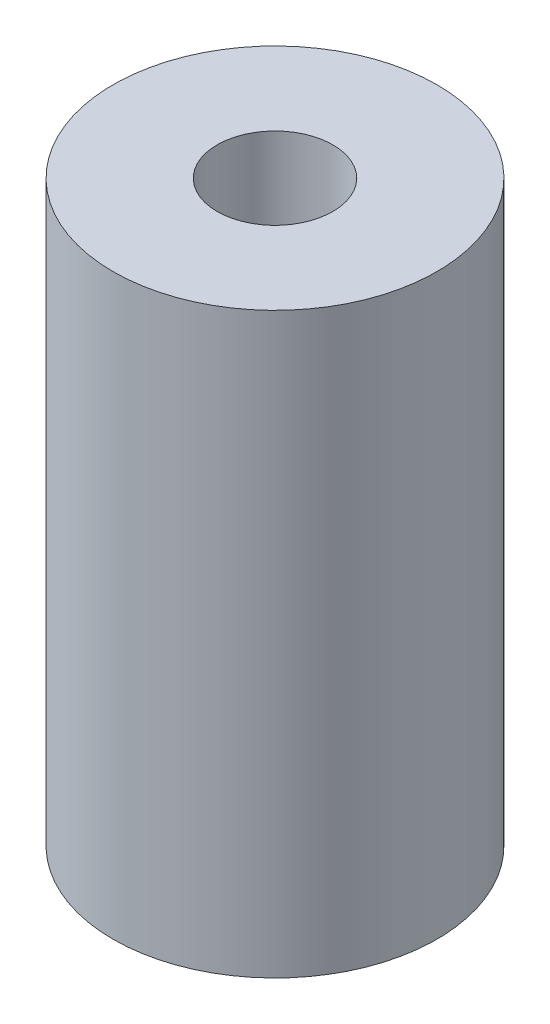
ISO-10303-21;
HEADER;
FILE_DESCRIPTION(('STEP AP214'),'2;1');
FILE_NAME('part.step','',(''),(''),'','','');
FILE_SCHEMA(('AUTOMOTIVE_DESIGN { 1 0 10303 214 1 1 1 1 }'));
ENDSEC;
DATA;
#1=APPLICATION_CONTEXT('core data for automotive mechanical design processes');
#2=APPLICATION_PROTOCOL_DEFINITION('international standard','automotive_design',2000,#1);
#3=PRODUCT_CONTEXT('',#1,'mechanical');
#4=PRODUCT('Part','Part','',(#3));
#5=PRODUCT_RELATED_PRODUCT_CATEGORY('part','',(#4));
#6=PRODUCT_DEFINITION_FORMATION('','',#4);
#7=PRODUCT_DEFINITION_CONTEXT('part definition',#1,'design');
#8=PRODUCT_DEFINITION('design','',#6,#7);
#9=PRODUCT_DEFINITION_SHAPE('','',#8);
#10=(LENGTH_UNIT() NAMED_UNIT(*) SI_UNIT(.MILLI.,.METRE.));
#11=(NAMED_UNIT(*) PLANE_ANGLE_UNIT() SI_UNIT($,.RADIAN.));
#12=(NAMED_UNIT(*) SI_UNIT($,.STERADIAN.) SOLID_ANGLE_UNIT());
#13=UNCERTAINTY_MEASURE_WITH_UNIT(LENGTH_MEASURE(1.E-05),#10,'distance_accuracy_value','');
#14=(GEOMETRIC_REPRESENTATION_CONTEXT(3) GLOBAL_UNCERTAINTY_ASSIGNED_CONTEXT((#13)) GLOBAL_UNIT_ASSIGNED_CONTEXT((#10,
#11,#12)) REPRESENTATION_CONTEXT('',''));
#15=CARTESIAN_POINT('',(0.,0.,0.));
#16=DIRECTION('',(0.,0.,1.));
#17=DIRECTION('',(1.,0.,0.));
#18=AXIS2_PLACEMENT_3D('',#15,#16,#17);
#19=CARTESIAN_POINT('',(0.,25.,0.));
#20=DIRECTION('',(0.,-1.,0.));
#21=DIRECTION('',(0.,0.,-1.));
#22=AXIS2_PLACEMENT_3D('',#19,#20,#21);
#23=CYLINDRICAL_SURFACE('',#22,7.);
#24=CARTESIAN_POINT('',(0.,25.,0.));
#25=DIRECTION('',(0.,1.,0.));
#26=DIRECTION('',(0.,0.,1.));
#27=AXIS2_PLACEMENT_3D('',#24,#25,#26);
#28=CIRCLE('',#27,7.);
#29=CARTESIAN_POINT('',(0.,25.,7.));
#30=VERTEX_POINT('',#29);
#31=EDGE_CURVE('E10',#30,#30,#28,.T.);
#32=ORIENTED_EDGE('',*,*,#31,.F.);
#33=EDGE_LOOP('',(#32));
#34=FACE_BOUND('',#33,.T.);
#35=CARTESIAN_POINT('',(0.,0.,0.));
#36=DIRECTION('',(0.,1.,0.));
#37=DIRECTION('',(0.,0.,1.));
#38=AXIS2_PLACEMENT_3D('',#35,#36,#37);
#39=CIRCLE('',#38,7.);
#40=CARTESIAN_POINT('',(0.,0.,7.));
#41=VERTEX_POINT('',#40);
#42=EDGE_CURVE('E36',#41,#41,#39,.T.);
#43=ORIENTED_EDGE('',*,*,#42,.T.);
#44=EDGE_LOOP('',(#43));
#45=FACE_BOUND('',#44,.T.);
#46=ADVANCED_FACE('F33',(#34,#45),#23,.T.);
#47=CARTESIAN_POINT('',(0.,25.,0.));
#48=DIRECTION('',(0.,1.,0.));
#49=DIRECTION('',(0.,0.,1.));
#50=AXIS2_PLACEMENT_3D('',#47,#48,#49);
#51=PLANE('',#50);
#52=CARTESIAN_POINT('',(0.,25.,0.));
#53=DIRECTION('',(0.,1.,0.));
#54=DIRECTION('',(0.,0.,1.));
#55=AXIS2_PLACEMENT_3D('',#52,#53,#54);
#56=CIRCLE('',#55,2.5);
#57=CARTESIAN_POINT('',(0.,25.,2.5));
#58=VERTEX_POINT('',#57);
#59=EDGE_CURVE('E43',#58,#58,#56,.T.);
#60=ORIENTED_EDGE('',*,*,#59,.F.);
#61=EDGE_LOOP('',(#60));
#62=FACE_BOUND('',#61,.T.);
#63=ORIENTED_EDGE('',*,*,#31,.T.);
#64=EDGE_LOOP('',(#63));
#65=FACE_BOUND('',#64,.T.);
#66=ADVANCED_FACE('F70',(#62,#65),#51,.T.);
#67=CARTESIAN_POINT('',(0.,0.,0.));
#68=DIRECTION('',(0.,1.,0.));
#69=DIRECTION('',(0.,0.,1.));
#70=AXIS2_PLACEMENT_3D('',#67,#68,#69);
#71=PLANE('',#70);
#72=CARTESIAN_POINT('',(0.,0.,0.));
#73=DIRECTION('',(0.,-1.,0.));
#74=DIRECTION('',(0.,0.,-1.));
#75=AXIS2_PLACEMENT_3D('',#72,#73,#74);
#76=CIRCLE('',#75,4.);
#77=CARTESIAN_POINT('',(0.,0.,-4.));
#78=VERTEX_POINT('',#77);
#79=EDGE_CURVE('E51',#78,#78,#76,.T.);
#80=ORIENTED_EDGE('',*,*,#79,.F.);
#81=EDGE_LOOP('',(#80));
#82=FACE_BOUND('',#81,.T.);
#83=ORIENTED_EDGE('',*,*,#42,.F.);
#84=EDGE_LOOP('',(#83));
#85=FACE_BOUND('',#84,.T.);
#86=ADVANCED_FACE('F66',(#82,#85),#71,.F.);
#87=CARTESIAN_POINT('',(0.,13.,0.));
#88=DIRECTION('',(0.,1.,0.));
#89=DIRECTION('',(0.,0.,1.));
#90=AXIS2_PLACEMENT_3D('',#87,#88,#89);
#91=CYLINDRICAL_SURFACE('',#90,2.5);
#92=CARTESIAN_POINT('',(0.,13.,0.));
#93=DIRECTION('',(0.,1.,0.));
#94=DIRECTION('',(0.,0.,1.));
#95=AXIS2_PLACEMENT_3D('',#92,#93,#94);
#96=CIRCLE('',#95,2.5);
#97=CARTESIAN_POINT('',(0.,13.,2.5));
#98=VERTEX_POINT('',#97);
#99=EDGE_CURVE('E47',#98,#98,#96,.T.);
#100=ORIENTED_EDGE('',*,*,#99,.F.);
#101=EDGE_LOOP('',(#100));
#102=FACE_BOUND('',#101,.T.);
#103=ORIENTED_EDGE('',*,*,#59,.T.);
#104=EDGE_LOOP('',(#103));
#105=FACE_BOUND('',#104,.T.);
#106=ADVANCED_FACE('F69',(#102,#105),#91,.F.);
#107=CARTESIAN_POINT('',(0.,13.,0.));
#108=DIRECTION('',(0.,-1.,0.));
#109=DIRECTION('',(0.,0.,-1.));
#110=AXIS2_PLACEMENT_3D('',#107,#108,#109);
#111=PLANE('',#110);
#112=CARTESIAN_POINT('',(0.,13.,0.));
#113=DIRECTION('',(0.,-1.,0.));
#114=DIRECTION('',(0.,0.,-1.));
#115=AXIS2_PLACEMENT_3D('',#112,#113,#114);
#116=CIRCLE('',#115,4.);
#117=CARTESIAN_POINT('',(0.,13.,-4.));
#118=VERTEX_POINT('',#117);
#119=EDGE_CURVE('E50',#118,#118,#116,.T.);
#120=ORIENTED_EDGE('',*,*,#119,.T.);
#121=EDGE_LOOP('',(#120));
#122=FACE_BOUND('',#121,.T.);
#123=ORIENTED_EDGE('',*,*,#99,.T.);
#124=EDGE_LOOP('',(#123));
#125=FACE_BOUND('',#124,.T.);
#126=ADVANCED_FACE('F57',(#122,#125),#111,.T.);
#127=CARTESIAN_POINT('',(0.,13.,0.));
#128=DIRECTION('',(0.,-1.,0.));
#129=DIRECTION('',(0.,0.,-1.));
#130=AXIS2_PLACEMENT_3D('',#127,#128,#129);
#131=CYLINDRICAL_SURFACE('',#130,4.);
#132=CARTESIAN_POINT('',(0.,13.,-4.));
#133=CARTESIAN_POINT('',(0.,12.8645833333333,-4.));
#134=CARTESIAN_POINT('',(0.,12.7291666666667,-4.));
#135=CARTESIAN_POINT('',(0.,12.4583333333333,-4.));
#136=CARTESIAN_POINT('',(0.,12.3229166666667,-4.));
#137=CARTESIAN_POINT('',(0.,12.0520833333333,-4.));
#138=CARTESIAN_POINT('',(0.,11.9166666666667,-4.));
#139=CARTESIAN_POINT('',(0.,11.6458333333333,-4.));
#140=CARTESIAN_POINT('',(0.,11.5104166666667,-4.));
#141=CARTESIAN_POINT('',(0.,11.2395833333333,-4.));
#142=CARTESIAN_POINT('',(0.,11.1041666666667,-4.));
#143=CARTESIAN_POINT('',(0.,10.8333333333333,-4.));
#144=CARTESIAN_POINT('',(0.,10.6979166666667,-4.));
#145=CARTESIAN_POINT('',(0.,10.4270833333333,-4.));
#146=CARTESIAN_POINT('',(0.,10.2916666666667,-4.));
#147=CARTESIAN_POINT('',(0.,10.0208333333333,-4.));
#148=CARTESIAN_POINT('',(0.,9.88541666666667,-4.));
#149=CARTESIAN_POINT('',(0.,9.61458333333333,-4.));
#150=CARTESIAN_POINT('',(0.,9.47916666666667,-4.));
#151=CARTESIAN_POINT('',(0.,9.20833333333333,-4.));
#152=CARTESIAN_POINT('',(0.,9.07291666666667,-4.));
#153=CARTESIAN_POINT('',(0.,8.80208333333333,-4.));
#154=CARTESIAN_POINT('',(0.,8.66666666666667,-4.));
#155=CARTESIAN_POINT('',(0.,8.39583333333333,-4.));
#156=CARTESIAN_POINT('',(0.,8.26041666666667,-4.));
#157=CARTESIAN_POINT('',(0.,7.98958333333333,-4.));
#158=CARTESIAN_POINT('',(0.,7.85416666666667,-4.));
#159=CARTESIAN_POINT('',(0.,7.58333333333333,-4.));
#160=CARTESIAN_POINT('',(0.,7.44791666666667,-4.));
#161=CARTESIAN_POINT('',(0.,7.17708333333333,-4.));
#162=CARTESIAN_POINT('',(0.,7.04166666666667,-4.));
#163=CARTESIAN_POINT('',(0.,6.77083333333333,-4.));
#164=CARTESIAN_POINT('',(0.,6.63541666666667,-4.));
#165=CARTESIAN_POINT('',(0.,6.36458333333333,-4.));
#166=CARTESIAN_POINT('',(0.,6.22916666666667,-4.));
#167=CARTESIAN_POINT('',(0.,5.95833333333333,-4.));
#168=CARTESIAN_POINT('',(0.,5.82291666666667,-4.));
#169=CARTESIAN_POINT('',(0.,5.55208333333333,-4.));
#170=CARTESIAN_POINT('',(0.,5.41666666666667,-4.));
#171=CARTESIAN_POINT('',(0.,5.14583333333333,-4.));
#172=CARTESIAN_POINT('',(0.,5.01041666666667,-4.));
#173=CARTESIAN_POINT('',(0.,4.73958333333333,-4.));
#174=CARTESIAN_POINT('',(0.,4.60416666666667,-4.));
#175=CARTESIAN_POINT('',(0.,4.33333333333333,-4.));
#176=CARTESIAN_POINT('',(0.,4.19791666666667,-4.));
#177=CARTESIAN_POINT('',(0.,3.92708333333333,-4.));
#178=CARTESIAN_POINT('',(0.,3.79166666666667,-4.));
#179=CARTESIAN_POINT('',(0.,3.52083333333333,-4.));
#180=CARTESIAN_POINT('',(0.,3.38541666666667,-4.));
#181=CARTESIAN_POINT('',(0.,3.11458333333333,-4.));
#182=CARTESIAN_POINT('',(0.,2.97916666666667,-4.));
#183=CARTESIAN_POINT('',(0.,2.70833333333333,-4.));
#184=CARTESIAN_POINT('',(0.,2.57291666666667,-4.));
#185=CARTESIAN_POINT('',(0.,2.30208333333333,-4.));
#186=CARTESIAN_POINT('',(0.,2.16666666666667,-4.));
#187=CARTESIAN_POINT('',(0.,1.89583333333333,-4.));
#188=CARTESIAN_POINT('',(0.,1.76041666666667,-4.));
#189=CARTESIAN_POINT('',(0.,1.48958333333333,-4.));
#190=CARTESIAN_POINT('',(0.,1.35416666666667,-4.));
#191=CARTESIAN_POINT('',(0.,1.08333333333333,-4.));
#192=CARTESIAN_POINT('',(0.,0.947916666666667,-4.));
#193=CARTESIAN_POINT('',(0.,0.677083333333334,-4.));
#194=CARTESIAN_POINT('',(0.,0.541666666666667,-4.));
#195=CARTESIAN_POINT('',(0.,0.270833333333334,-4.));
#196=CARTESIAN_POINT('',(0.,0.135416666666667,-4.));
#197=CARTESIAN_POINT('',(0.,0.,-4.));
#198=B_SPLINE_CURVE_WITH_KNOTS('',3,(#132,#133,#134,#135,#136,#137,#138,#139,#140,#141,#142,
#143,#144,#145,#146,#147,#148,#149,#150,#151,#152,#153,#154,#155,#156,#157,#158,#159,#160,#161,
#162,#163,#164,#165,#166,#167,#168,#169,#170,#171,#172,#173,#174,#175,#176,#177,#178,#179,#180,
#181,#182,#183,#184,#185,#186,#187,#188,#189,#190,#191,#192,#193,#194,#195,#196,#197),
.UNSPECIFIED.,.F.,.F.,(4,2,2,2,2,2,2,2,2,2,2,2,2,2,2,2,2,2,2,2,2,2,2,2,2,2,2,2,2,2,2,2,4),(0.,
0.406249999999999,0.812499999999999,1.21875,1.625,2.03125,2.4375,2.84375,3.25,3.65625,4.0625,
4.46875,4.875,5.28125,5.6875,6.09375,6.5,6.90625,7.3125,7.71875,8.125,8.53125,8.9375,9.34375,
9.75,10.15625,10.5625,10.96875,11.375,11.78125,12.1875,12.59375,13.),.UNSPECIFIED.);
#199=EDGE_CURVE('BSEAM60',#118,#78,#198,.T.);
#200=ORIENTED_EDGE('',*,*,#119,.F.);
#201=ORIENTED_EDGE('',*,*,#79,.T.);
#202=ORIENTED_EDGE('',*,*,#199,.T.);
#203=ORIENTED_EDGE('',*,*,#199,.F.);
#204=EDGE_LOOP('',(#200,#202,#201,#203));
#205=FACE_BOUND('',#204,.T.);
#206=ADVANCED_FACE('F60',(#205),#131,.F.);
#207=CLOSED_SHELL('',(#46,#66,#86,#106,#126,#206));
#208=MANIFOLD_SOLID_BREP('B2',#207);
#209=ADVANCED_BREP_SHAPE_REPRESENTATION('',(#18,#208),#14);
#210=SHAPE_DEFINITION_REPRESENTATION(#9,#209);
ENDSEC;
END-ISO-10303-21;
